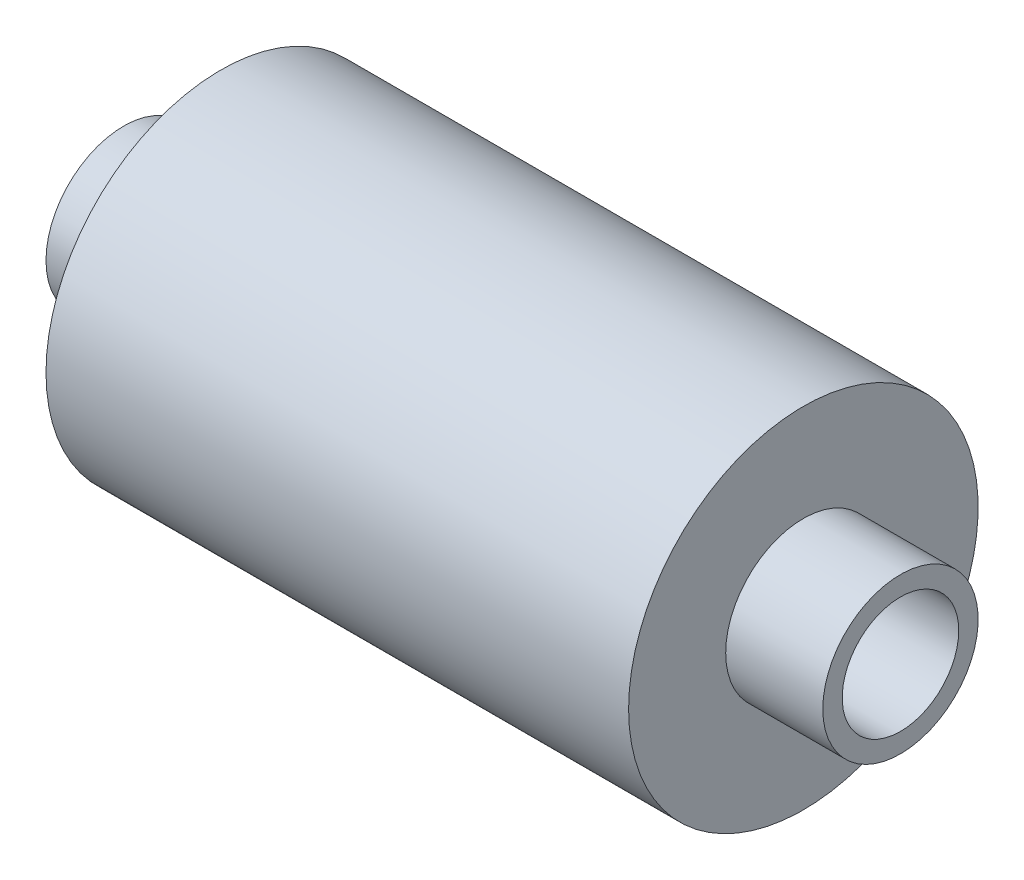
ISO-10303-21;
HEADER;
FILE_DESCRIPTION(('STEP AP214'),'2;1');
FILE_NAME('part.step','',(''),(''),'','','');
FILE_SCHEMA(('AUTOMOTIVE_DESIGN { 1 0 10303 214 1 1 1 1 }'));
ENDSEC;
DATA;
#1=APPLICATION_CONTEXT('core data for automotive mechanical design processes');
#2=APPLICATION_PROTOCOL_DEFINITION('international standard','automotive_design',2000,#1);
#3=PRODUCT_CONTEXT('',#1,'mechanical');
#4=PRODUCT('Part','Part','',(#3));
#5=PRODUCT_RELATED_PRODUCT_CATEGORY('part','',(#4));
#6=PRODUCT_DEFINITION_FORMATION('','',#4);
#7=PRODUCT_DEFINITION_CONTEXT('part definition',#1,'design');
#8=PRODUCT_DEFINITION('design','',#6,#7);
#9=PRODUCT_DEFINITION_SHAPE('','',#8);
#10=(LENGTH_UNIT() NAMED_UNIT(*) SI_UNIT(.MILLI.,.METRE.));
#11=(NAMED_UNIT(*) PLANE_ANGLE_UNIT() SI_UNIT($,.RADIAN.));
#12=(NAMED_UNIT(*) SI_UNIT($,.STERADIAN.) SOLID_ANGLE_UNIT());
#13=UNCERTAINTY_MEASURE_WITH_UNIT(LENGTH_MEASURE(1.E-05),#10,'distance_accuracy_value','');
#14=(GEOMETRIC_REPRESENTATION_CONTEXT(3) GLOBAL_UNCERTAINTY_ASSIGNED_CONTEXT((#13)) GLOBAL_UNIT_ASSIGNED_CONTEXT((#10,
#11,#12)) REPRESENTATION_CONTEXT('',''));
#15=CARTESIAN_POINT('',(0.,0.,0.));
#16=DIRECTION('',(0.,0.,1.));
#17=DIRECTION('',(1.,0.,0.));
#18=AXIS2_PLACEMENT_3D('',#15,#16,#17);
#19=CARTESIAN_POINT('',(40.,0.,0.));
#20=DIRECTION('',(-1.,0.,0.));
#21=DIRECTION('',(0.,0.,1.));
#22=AXIS2_PLACEMENT_3D('',#19,#20,#21);
#23=CYLINDRICAL_SURFACE('',#22,9.);
#24=CARTESIAN_POINT('',(5.,0.,0.));
#25=DIRECTION('',(-1.,0.,0.));
#26=DIRECTION('',(0.,0.,1.));
#27=AXIS2_PLACEMENT_3D('',#24,#25,#26);
#28=CIRCLE('',#27,9.);
#29=CARTESIAN_POINT('',(5.,0.,9.));
#30=VERTEX_POINT('',#29);
#31=EDGE_CURVE('E46',#30,#30,#28,.T.);
#32=ORIENTED_EDGE('',*,*,#31,.F.);
#33=EDGE_LOOP('',(#32));
#34=FACE_BOUND('',#33,.T.);
#35=CARTESIAN_POINT('',(35.,0.,0.));
#36=DIRECTION('',(-1.,0.,0.));
#37=DIRECTION('',(0.,0.,1.));
#38=AXIS2_PLACEMENT_3D('',#35,#36,#37);
#39=CIRCLE('',#38,9.);
#40=CARTESIAN_POINT('',(35.,0.,9.));
#41=VERTEX_POINT('',#40);
#42=EDGE_CURVE('E55',#41,#41,#39,.T.);
#43=ORIENTED_EDGE('',*,*,#42,.T.);
#44=EDGE_LOOP('',(#43));
#45=FACE_BOUND('',#44,.T.);
#46=ADVANCED_FACE('F29',(#34,#45),#23,.T.);
#47=CARTESIAN_POINT('',(40.,0.,0.));
#48=DIRECTION('',(1.,0.,0.));
#49=DIRECTION('',(0.,0.,-1.));
#50=AXIS2_PLACEMENT_3D('',#47,#48,#49);
#51=PLANE('',#50);
#52=CARTESIAN_POINT('',(40.,0.,0.));
#53=DIRECTION('',(1.,0.,0.));
#54=DIRECTION('',(0.,0.,-1.));
#55=AXIS2_PLACEMENT_3D('',#52,#53,#54);
#56=CIRCLE('',#55,3.);
#57=CARTESIAN_POINT('',(40.,0.,-3.));
#58=VERTEX_POINT('',#57);
#59=EDGE_CURVE('E10',#58,#58,#56,.T.);
#60=ORIENTED_EDGE('',*,*,#59,.F.);
#61=EDGE_LOOP('',(#60));
#62=FACE_BOUND('',#61,.T.);
#63=CARTESIAN_POINT('',(40.,0.,0.));
#64=DIRECTION('',(-1.,0.,0.));
#65=DIRECTION('',(0.,0.,1.));
#66=AXIS2_PLACEMENT_3D('',#63,#64,#65);
#67=CIRCLE('',#66,4.);
#68=CARTESIAN_POINT('',(40.,0.,4.));
#69=VERTEX_POINT('',#68);
#70=EDGE_CURVE('E49',#69,#69,#67,.T.);
#71=ORIENTED_EDGE('',*,*,#70,.F.);
#72=EDGE_LOOP('',(#71));
#73=FACE_BOUND('',#72,.T.);
#74=ADVANCED_FACE('F72',(#62,#73),#51,.T.);
#75=CARTESIAN_POINT('',(0.,0.,0.));
#76=DIRECTION('',(1.,0.,0.));
#77=DIRECTION('',(0.,0.,-1.));
#78=AXIS2_PLACEMENT_3D('',#75,#76,#77);
#79=PLANE('',#78);
#80=CARTESIAN_POINT('',(0.,0.,0.));
#81=DIRECTION('',(1.,0.,0.));
#82=DIRECTION('',(0.,0.,-1.));
#83=AXIS2_PLACEMENT_3D('',#80,#81,#82);
#84=CIRCLE('',#83,3.);
#85=CARTESIAN_POINT('',(0.,0.,-3.));
#86=VERTEX_POINT('',#85);
#87=EDGE_CURVE('E32',#86,#86,#84,.T.);
#88=ORIENTED_EDGE('',*,*,#87,.T.);
#89=EDGE_LOOP('',(#88));
#90=FACE_BOUND('',#89,.T.);
#91=CARTESIAN_POINT('',(0.,0.,0.));
#92=DIRECTION('',(-1.,0.,0.));
#93=DIRECTION('',(0.,0.,1.));
#94=AXIS2_PLACEMENT_3D('',#91,#92,#93);
#95=CIRCLE('',#94,4.);
#96=CARTESIAN_POINT('',(0.,0.,4.));
#97=VERTEX_POINT('',#96);
#98=EDGE_CURVE('E39',#97,#97,#95,.T.);
#99=ORIENTED_EDGE('',*,*,#98,.T.);
#100=EDGE_LOOP('',(#99));
#101=FACE_BOUND('',#100,.T.);
#102=ADVANCED_FACE('F77',(#90,#101),#79,.F.);
#103=CARTESIAN_POINT('',(40.,0.,0.));
#104=DIRECTION('',(-1.,0.,0.));
#105=DIRECTION('',(0.,0.,1.));
#106=AXIS2_PLACEMENT_3D('',#103,#104,#105);
#107=CYLINDRICAL_SURFACE('',#106,3.);
#108=ORIENTED_EDGE('',*,*,#59,.T.);
#109=EDGE_LOOP('',(#108));
#110=FACE_BOUND('',#109,.T.);
#111=ORIENTED_EDGE('',*,*,#87,.F.);
#112=EDGE_LOOP('',(#111));
#113=FACE_BOUND('',#112,.T.);
#114=ADVANCED_FACE('F90',(#110,#113),#107,.F.);
#115=CARTESIAN_POINT('',(0.,0.,0.));
#116=DIRECTION('',(-1.,0.,0.));
#117=DIRECTION('',(0.,0.,1.));
#118=AXIS2_PLACEMENT_3D('',#115,#116,#117);
#119=CYLINDRICAL_SURFACE('',#118,4.);
#120=CARTESIAN_POINT('',(5.,0.,0.));
#121=DIRECTION('',(-1.,0.,0.));
#122=DIRECTION('',(0.,0.,1.));
#123=AXIS2_PLACEMENT_3D('',#120,#121,#122);
#124=CIRCLE('',#123,4.);
#125=CARTESIAN_POINT('',(5.,0.,4.));
#126=VERTEX_POINT('',#125);
#127=EDGE_CURVE('E43',#126,#126,#124,.T.);
#128=ORIENTED_EDGE('',*,*,#127,.T.);
#129=EDGE_LOOP('',(#128));
#130=FACE_BOUND('',#129,.T.);
#131=ORIENTED_EDGE('',*,*,#98,.F.);
#132=EDGE_LOOP('',(#131));
#133=FACE_BOUND('',#132,.T.);
#134=ADVANCED_FACE('F84',(#130,#133),#119,.T.);
#135=CARTESIAN_POINT('',(5.,9.,0.));
#136=DIRECTION('',(-1.,0.,0.));
#137=DIRECTION('',(0.,0.,1.));
#138=AXIS2_PLACEMENT_3D('',#135,#136,#137);
#139=PLANE('',#138);
#140=ORIENTED_EDGE('',*,*,#31,.T.);
#141=EDGE_LOOP('',(#140));
#142=FACE_BOUND('',#141,.T.);
#143=ORIENTED_EDGE('',*,*,#127,.F.);
#144=EDGE_LOOP('',(#143));
#145=FACE_BOUND('',#144,.T.);
#146=ADVANCED_FACE('F68',(#142,#145),#139,.T.);
#147=CARTESIAN_POINT('',(0.,0.,0.));
#148=DIRECTION('',(-1.,0.,0.));
#149=DIRECTION('',(0.,0.,1.));
#150=AXIS2_PLACEMENT_3D('',#147,#148,#149);
#151=CYLINDRICAL_SURFACE('',#150,4.);
#152=ORIENTED_EDGE('',*,*,#70,.T.);
#153=EDGE_LOOP('',(#152));
#154=FACE_BOUND('',#153,.T.);
#155=CARTESIAN_POINT('',(35.,0.,0.));
#156=DIRECTION('',(-1.,0.,0.));
#157=DIRECTION('',(0.,0.,1.));
#158=AXIS2_PLACEMENT_3D('',#155,#156,#157);
#159=CIRCLE('',#158,4.);
#160=CARTESIAN_POINT('',(35.,0.,4.));
#161=VERTEX_POINT('',#160);
#162=EDGE_CURVE('E52',#161,#161,#159,.T.);
#163=ORIENTED_EDGE('',*,*,#162,.F.);
#164=EDGE_LOOP('',(#163));
#165=FACE_BOUND('',#164,.T.);
#166=ADVANCED_FACE('F62',(#154,#165),#151,.T.);
#167=CARTESIAN_POINT('',(35.,9.,0.));
#168=DIRECTION('',(1.,0.,0.));
#169=DIRECTION('',(0.,0.,-1.));
#170=AXIS2_PLACEMENT_3D('',#167,#168,#169);
#171=PLANE('',#170);
#172=ORIENTED_EDGE('',*,*,#162,.T.);
#173=EDGE_LOOP('',(#172));
#174=FACE_BOUND('',#173,.T.);
#175=ORIENTED_EDGE('',*,*,#42,.F.);
#176=EDGE_LOOP('',(#175));
#177=FACE_BOUND('',#176,.T.);
#178=ADVANCED_FACE('F60',(#174,#177),#171,.T.);
#179=CLOSED_SHELL('',(#46,#74,#102,#114,#134,#146,#166,#178));
#180=MANIFOLD_SOLID_BREP('B2',#179);
#181=ADVANCED_BREP_SHAPE_REPRESENTATION('',(#18,#180),#14);
#182=SHAPE_DEFINITION_REPRESENTATION(#9,#181);
ENDSEC;
END-ISO-10303-21;
